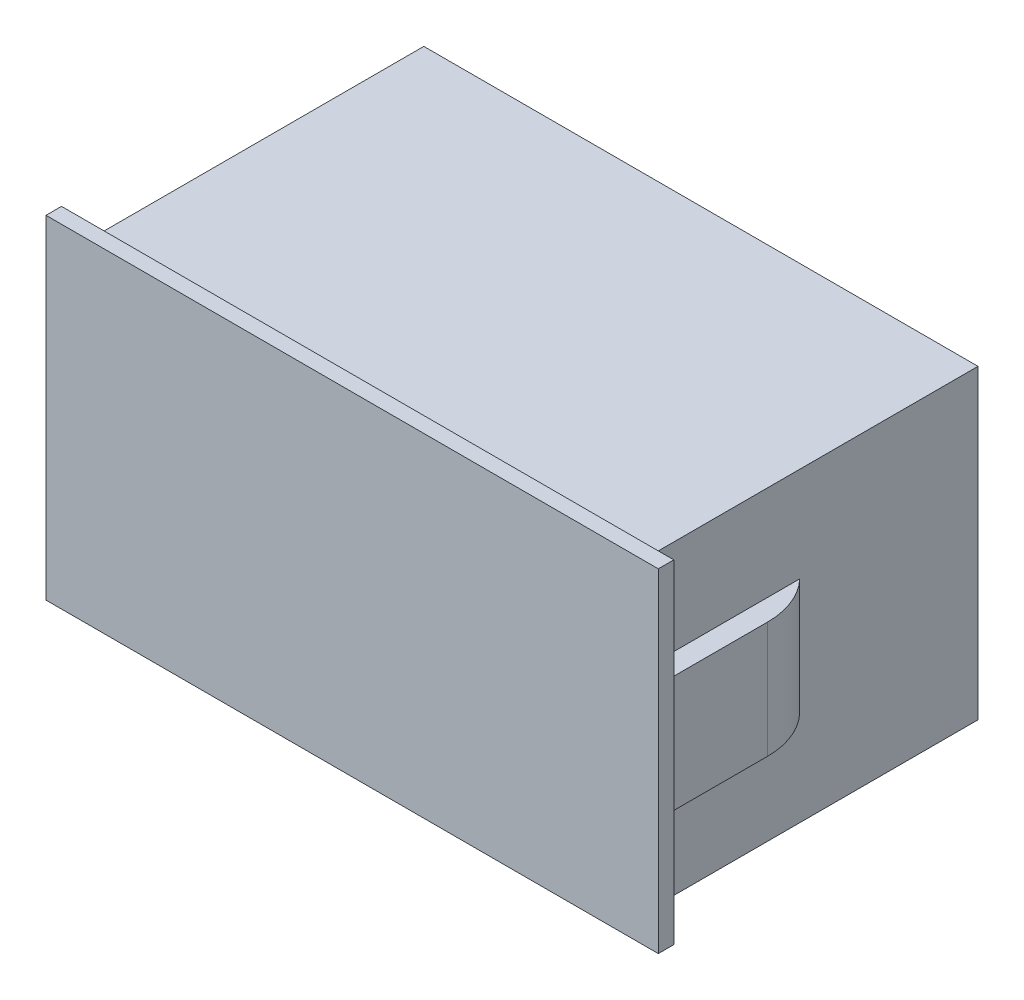
ISO-10303-21;
HEADER;
FILE_DESCRIPTION(('STEP AP214'),'2;1');
FILE_NAME('part.step','',(''),(''),'','','');
FILE_SCHEMA(('AUTOMOTIVE_DESIGN { 1 0 10303 214 1 1 1 1 }'));
ENDSEC;
DATA;
#1=APPLICATION_CONTEXT('core data for automotive mechanical design processes');
#2=APPLICATION_PROTOCOL_DEFINITION('international standard','automotive_design',2000,#1);
#3=PRODUCT_CONTEXT('',#1,'mechanical');
#4=PRODUCT('Part','Part','',(#3));
#5=PRODUCT_RELATED_PRODUCT_CATEGORY('part','',(#4));
#6=PRODUCT_DEFINITION_FORMATION('','',#4);
#7=PRODUCT_DEFINITION_CONTEXT('part definition',#1,'design');
#8=PRODUCT_DEFINITION('design','',#6,#7);
#9=PRODUCT_DEFINITION_SHAPE('','',#8);
#10=(LENGTH_UNIT() NAMED_UNIT(*) SI_UNIT(.MILLI.,.METRE.));
#11=(NAMED_UNIT(*) PLANE_ANGLE_UNIT() SI_UNIT($,.RADIAN.));
#12=(NAMED_UNIT(*) SI_UNIT($,.STERADIAN.) SOLID_ANGLE_UNIT());
#13=UNCERTAINTY_MEASURE_WITH_UNIT(LENGTH_MEASURE(1.E-05),#10,'distance_accuracy_value','');
#14=(GEOMETRIC_REPRESENTATION_CONTEXT(3) GLOBAL_UNCERTAINTY_ASSIGNED_CONTEXT((#13)) GLOBAL_UNIT_ASSIGNED_CONTEXT((#10,
#11,#12)) REPRESENTATION_CONTEXT('',''));
#15=CARTESIAN_POINT('',(0.,0.,0.));
#16=DIRECTION('',(0.,0.,1.));
#17=DIRECTION('',(1.,0.,0.));
#18=AXIS2_PLACEMENT_3D('',#15,#16,#17);
#19=CARTESIAN_POINT('',(0.,0.,43.));
#20=DIRECTION('',(0.,0.,1.));
#21=DIRECTION('',(1.,0.,0.));
#22=AXIS2_PLACEMENT_3D('',#19,#20,#21);
#23=PLANE('',#22);
#24=DIRECTION('',(0.,-1.,0.));
#25=VECTOR('',#24,1.);
#26=CARTESIAN_POINT('',(39.5,-21.5,43.));
#27=LINE('',#26,#25);
#28=CARTESIAN_POINT('',(39.5,21.5,43.));
#29=VERTEX_POINT('',#28);
#30=CARTESIAN_POINT('',(39.5,-21.5,43.));
#31=VERTEX_POINT('',#30);
#32=EDGE_CURVE('E207',#29,#31,#27,.T.);
#33=ORIENTED_EDGE('',*,*,#32,.T.);
#34=DIRECTION('',(-1.,0.,0.));
#35=VECTOR('',#34,1.);
#36=CARTESIAN_POINT('',(-39.5,-21.5,43.));
#37=LINE('',#36,#35);
#38=CARTESIAN_POINT('',(-39.5,-21.5,43.));
#39=VERTEX_POINT('',#38);
#40=EDGE_CURVE('E225',#31,#39,#37,.T.);
#41=ORIENTED_EDGE('',*,*,#40,.T.);
#42=DIRECTION('',(0.,1.,0.));
#43=VECTOR('',#42,1.);
#44=CARTESIAN_POINT('',(-39.5,-21.5,43.));
#45=LINE('',#44,#43);
#46=CARTESIAN_POINT('',(-39.5,21.5,43.));
#47=VERTEX_POINT('',#46);
#48=EDGE_CURVE('E227',#39,#47,#45,.T.);
#49=ORIENTED_EDGE('',*,*,#48,.T.);
#50=DIRECTION('',(1.,0.,0.));
#51=VECTOR('',#50,1.);
#52=CARTESIAN_POINT('',(-39.5,21.5,43.));
#53=LINE('',#52,#51);
#54=EDGE_CURVE('E239',#47,#29,#53,.T.);
#55=ORIENTED_EDGE('',*,*,#54,.T.);
#56=EDGE_LOOP('',(#33,#41,#49,#55));
#57=FACE_BOUND('',#56,.T.);
#58=DIRECTION('',(-1.,0.,0.));
#59=VECTOR('',#58,1.);
#60=CARTESIAN_POINT('',(-38.5,-7.49999999999999,43.));
#61=LINE('',#60,#59);
#62=CARTESIAN_POINT('',(-35.75,-7.49999999999999,43.));
#63=VERTEX_POINT('',#62);
#64=CARTESIAN_POINT('',(-38.5,-7.49999999999999,43.));
#65=VERTEX_POINT('',#64);
#66=EDGE_CURVE('E180',#63,#65,#61,.T.);
#67=ORIENTED_EDGE('',*,*,#66,.F.);
#68=DIRECTION('',(0.,1.,0.));
#69=VECTOR('',#68,1.);
#70=CARTESIAN_POINT('',(-35.75,19.75,43.));
#71=LINE('',#70,#69);
#72=CARTESIAN_POINT('',(-35.75,-19.75,43.));
#73=VERTEX_POINT('',#72);
#74=EDGE_CURVE('E166',#73,#63,#71,.T.);
#75=ORIENTED_EDGE('',*,*,#74,.F.);
#76=DIRECTION('',(-1.,0.,0.));
#77=VECTOR('',#76,1.);
#78=CARTESIAN_POINT('',(35.75,-19.75,43.));
#79=LINE('',#78,#77);
#80=CARTESIAN_POINT('',(35.75,-19.75,43.));
#81=VERTEX_POINT('',#80);
#82=EDGE_CURVE('E220',#81,#73,#79,.T.);
#83=ORIENTED_EDGE('',*,*,#82,.F.);
#84=DIRECTION('',(0.,-1.,0.));
#85=VECTOR('',#84,1.);
#86=CARTESIAN_POINT('',(35.75,19.75,43.));
#87=LINE('',#86,#85);
#88=CARTESIAN_POINT('',(35.75,-7.5,43.));
#89=VERTEX_POINT('',#88);
#90=EDGE_CURVE('E237',#89,#81,#87,.T.);
#91=ORIENTED_EDGE('',*,*,#90,.F.);
#92=DIRECTION('',(-1.,0.,0.));
#93=VECTOR('',#92,1.);
#94=CARTESIAN_POINT('',(38.5,-7.5,43.));
#95=LINE('',#94,#93);
#96=CARTESIAN_POINT('',(38.5,-7.5,43.));
#97=VERTEX_POINT('',#96);
#98=EDGE_CURVE('E190',#97,#89,#95,.T.);
#99=ORIENTED_EDGE('',*,*,#98,.F.);
#100=DIRECTION('',(0.,-1.,0.));
#101=VECTOR('',#100,1.);
#102=CARTESIAN_POINT('',(38.5,7.5,43.));
#103=LINE('',#102,#101);
#104=CARTESIAN_POINT('',(38.5,7.5,43.));
#105=VERTEX_POINT('',#104);
#106=EDGE_CURVE('E193',#105,#97,#103,.T.);
#107=ORIENTED_EDGE('',*,*,#106,.F.);
#108=DIRECTION('',(1.,0.,0.));
#109=VECTOR('',#108,1.);
#110=CARTESIAN_POINT('',(38.5,7.5,43.));
#111=LINE('',#110,#109);
#112=CARTESIAN_POINT('',(35.75,7.5,43.));
#113=VERTEX_POINT('',#112);
#114=EDGE_CURVE('E167',#113,#105,#111,.T.);
#115=ORIENTED_EDGE('',*,*,#114,.F.);
#116=CARTESIAN_POINT('',(35.75,19.75,43.));
#117=VERTEX_POINT('',#116);
#118=EDGE_CURVE('E233',#117,#113,#87,.T.);
#119=ORIENTED_EDGE('',*,*,#118,.F.);
#120=DIRECTION('',(1.,0.,0.));
#121=VECTOR('',#120,1.);
#122=CARTESIAN_POINT('',(35.75,19.75,43.));
#123=LINE('',#122,#121);
#124=CARTESIAN_POINT('',(-35.75,19.75,43.));
#125=VERTEX_POINT('',#124);
#126=EDGE_CURVE('E229',#125,#117,#123,.T.);
#127=ORIENTED_EDGE('',*,*,#126,.F.);
#128=CARTESIAN_POINT('',(-35.75,7.5,43.));
#129=VERTEX_POINT('',#128);
#130=EDGE_CURVE('E230',#129,#125,#71,.T.);
#131=ORIENTED_EDGE('',*,*,#130,.F.);
#132=DIRECTION('',(1.,0.,0.));
#133=VECTOR('',#132,1.);
#134=CARTESIAN_POINT('',(-38.5,7.5,43.));
#135=LINE('',#134,#133);
#136=CARTESIAN_POINT('',(-38.5,7.5,43.));
#137=VERTEX_POINT('',#136);
#138=EDGE_CURVE('E172',#137,#129,#135,.T.);
#139=ORIENTED_EDGE('',*,*,#138,.F.);
#140=DIRECTION('',(0.,1.,0.));
#141=VECTOR('',#140,1.);
#142=CARTESIAN_POINT('',(-38.5,-7.49999999999999,43.));
#143=LINE('',#142,#141);
#144=EDGE_CURVE('E177',#65,#137,#143,.T.);
#145=ORIENTED_EDGE('',*,*,#144,.F.);
#146=EDGE_LOOP('',(#67,#75,#83,#91,#99,#107,#115,#119,#127,#131,#139,#145));
#147=FACE_BOUND('',#146,.T.);
#148=ADVANCED_FACE('F36',(#57,#147),#23,.F.);
#149=CARTESIAN_POINT('',(-35.75,19.75,134.944427287075));
#150=DIRECTION('',(-1.,0.,0.));
#151=DIRECTION('',(0.,0.,1.));
#152=AXIS2_PLACEMENT_3D('',#149,#150,#151);
#153=PLANE('',#152);
#154=ORIENTED_EDGE('',*,*,#74,.T.);
#155=DIRECTION('',(0.,0.,1.));
#156=VECTOR('',#155,1.);
#157=CARTESIAN_POINT('',(-35.75,-7.49999999999999,23.));
#158=LINE('',#157,#156);
#159=CARTESIAN_POINT('',(-35.75,-7.49999999999999,23.));
#160=VERTEX_POINT('',#159);
#161=EDGE_CURVE('E152',#160,#63,#158,.T.);
#162=ORIENTED_EDGE('',*,*,#161,.F.);
#163=DIRECTION('',(0.,-1.,0.));
#164=VECTOR('',#163,1.);
#165=CARTESIAN_POINT('',(-35.75,-7.49999999999999,23.));
#166=LINE('',#165,#164);
#167=CARTESIAN_POINT('',(-35.75,7.5,23.));
#168=VERTEX_POINT('',#167);
#169=EDGE_CURVE('E163',#168,#160,#166,.T.);
#170=ORIENTED_EDGE('',*,*,#169,.F.);
#171=DIRECTION('',(0.,0.,1.));
#172=VECTOR('',#171,1.);
#173=CARTESIAN_POINT('',(-35.75,7.5,23.));
#174=LINE('',#173,#172);
#175=EDGE_CURVE('E171',#168,#129,#174,.T.);
#176=ORIENTED_EDGE('',*,*,#175,.T.);
#177=ORIENTED_EDGE('',*,*,#130,.T.);
#178=DIRECTION('',(0.,0.,-1.));
#179=VECTOR('',#178,1.);
#180=CARTESIAN_POINT('',(-35.75,19.75,134.944427287075));
#181=LINE('',#180,#179);
#182=CARTESIAN_POINT('',(-35.75,19.75,0.));
#183=VERTEX_POINT('',#182);
#184=EDGE_CURVE('E216',#125,#183,#181,.T.);
#185=ORIENTED_EDGE('',*,*,#184,.T.);
#186=DIRECTION('',(0.,1.,0.));
#187=VECTOR('',#186,1.);
#188=CARTESIAN_POINT('',(-35.75,19.75,0.));
#189=LINE('',#188,#187);
#190=CARTESIAN_POINT('',(-35.75,-19.75,0.));
#191=VERTEX_POINT('',#190);
#192=EDGE_CURVE('E221',#191,#183,#189,.T.);
#193=ORIENTED_EDGE('',*,*,#192,.F.);
#194=DIRECTION('',(0.,0.,-1.));
#195=VECTOR('',#194,1.);
#196=CARTESIAN_POINT('',(-35.75,-19.75,134.944427287075));
#197=LINE('',#196,#195);
#198=EDGE_CURVE('E224',#73,#191,#197,.T.);
#199=ORIENTED_EDGE('',*,*,#198,.F.);
#200=EDGE_LOOP('',(#154,#162,#170,#176,#177,#185,#193,#199));
#201=FACE_BOUND('',#200,.T.);
#202=ADVANCED_FACE('F162',(#201),#153,.T.);
#203=CARTESIAN_POINT('',(35.75,19.75,134.944427287075));
#204=DIRECTION('',(1.,0.,0.));
#205=DIRECTION('',(0.,0.,-1.));
#206=AXIS2_PLACEMENT_3D('',#203,#204,#205);
#207=PLANE('',#206);
#208=ORIENTED_EDGE('',*,*,#118,.T.);
#209=DIRECTION('',(0.,0.,1.));
#210=VECTOR('',#209,1.);
#211=CARTESIAN_POINT('',(35.75,7.5,23.));
#212=LINE('',#211,#210);
#213=CARTESIAN_POINT('',(35.75,7.5,23.));
#214=VERTEX_POINT('',#213);
#215=EDGE_CURVE('E204',#214,#113,#212,.T.);
#216=ORIENTED_EDGE('',*,*,#215,.F.);
#217=DIRECTION('',(0.,1.,0.));
#218=VECTOR('',#217,1.);
#219=CARTESIAN_POINT('',(35.75,7.5,23.));
#220=LINE('',#219,#218);
#221=CARTESIAN_POINT('',(35.75,-7.5,23.));
#222=VERTEX_POINT('',#221);
#223=EDGE_CURVE('E186',#222,#214,#220,.T.);
#224=ORIENTED_EDGE('',*,*,#223,.F.);
#225=DIRECTION('',(0.,0.,1.));
#226=VECTOR('',#225,1.);
#227=CARTESIAN_POINT('',(35.75,-7.5,23.));
#228=LINE('',#227,#226);
#229=EDGE_CURVE('E189',#222,#89,#228,.T.);
#230=ORIENTED_EDGE('',*,*,#229,.T.);
#231=ORIENTED_EDGE('',*,*,#90,.T.);
#232=DIRECTION('',(0.,0.,-1.));
#233=VECTOR('',#232,1.);
#234=CARTESIAN_POINT('',(35.75,-19.75,134.944427287075));
#235=LINE('',#234,#233);
#236=CARTESIAN_POINT('',(35.75,-19.75,0.));
#237=VERTEX_POINT('',#236);
#238=EDGE_CURVE('E212',#81,#237,#235,.T.);
#239=ORIENTED_EDGE('',*,*,#238,.T.);
#240=DIRECTION('',(0.,-1.,0.));
#241=VECTOR('',#240,1.);
#242=CARTESIAN_POINT('',(35.75,19.75,0.));
#243=LINE('',#242,#241);
#244=CARTESIAN_POINT('',(35.75,19.75,0.));
#245=VERTEX_POINT('',#244);
#246=EDGE_CURVE('E213',#245,#237,#243,.T.);
#247=ORIENTED_EDGE('',*,*,#246,.F.);
#248=DIRECTION('',(0.,0.,-1.));
#249=VECTOR('',#248,1.);
#250=CARTESIAN_POINT('',(35.75,19.75,134.944427287075));
#251=LINE('',#250,#249);
#252=EDGE_CURVE('E211',#117,#245,#251,.T.);
#253=ORIENTED_EDGE('',*,*,#252,.F.);
#254=EDGE_LOOP('',(#208,#216,#224,#230,#231,#239,#247,#253));
#255=FACE_BOUND('',#254,.T.);
#256=ADVANCED_FACE('F298',(#255),#207,.T.);
#257=CARTESIAN_POINT('',(39.5,21.5,45.));
#258=DIRECTION('',(-1.,0.,0.));
#259=DIRECTION('',(0.,-1.,0.));
#260=AXIS2_PLACEMENT_3D('',#257,#258,#259);
#261=PLANE('',#260);
#262=DIRECTION('',(0.,0.,-1.));
#263=VECTOR('',#262,1.);
#264=CARTESIAN_POINT('',(39.5,-21.5,45.));
#265=LINE('',#264,#263);
#266=CARTESIAN_POINT('',(39.5,-21.5,45.));
#267=VERTEX_POINT('',#266);
#268=EDGE_CURVE('E257',#267,#31,#265,.T.);
#269=ORIENTED_EDGE('',*,*,#268,.T.);
#270=ORIENTED_EDGE('',*,*,#32,.F.);
#271=DIRECTION('',(0.,0.,-1.));
#272=VECTOR('',#271,1.);
#273=CARTESIAN_POINT('',(39.5,21.5,45.));
#274=LINE('',#273,#272);
#275=CARTESIAN_POINT('',(39.5,21.5,45.));
#276=VERTEX_POINT('',#275);
#277=EDGE_CURVE('E266',#276,#29,#274,.T.);
#278=ORIENTED_EDGE('',*,*,#277,.F.);
#279=DIRECTION('',(0.,1.,0.));
#280=VECTOR('',#279,1.);
#281=CARTESIAN_POINT('',(39.5,21.5,45.));
#282=LINE('',#281,#280);
#283=EDGE_CURVE('E236',#267,#276,#282,.T.);
#284=ORIENTED_EDGE('',*,*,#283,.F.);
#285=EDGE_LOOP('',(#269,#270,#278,#284));
#286=FACE_BOUND('',#285,.T.);
#287=ADVANCED_FACE('F339',(#286),#261,.F.);
#288=CARTESIAN_POINT('',(-39.5,21.5,45.));
#289=DIRECTION('',(0.,-1.,0.));
#290=DIRECTION('',(0.,0.,-1.));
#291=AXIS2_PLACEMENT_3D('',#288,#289,#290);
#292=PLANE('',#291);
#293=ORIENTED_EDGE('',*,*,#277,.T.);
#294=ORIENTED_EDGE('',*,*,#54,.F.);
#295=DIRECTION('',(0.,0.,-1.));
#296=VECTOR('',#295,1.);
#297=CARTESIAN_POINT('',(-39.5,21.5,45.));
#298=LINE('',#297,#296);
#299=CARTESIAN_POINT('',(-39.5,21.5,45.));
#300=VERTEX_POINT('',#299);
#301=EDGE_CURVE('E263',#300,#47,#298,.T.);
#302=ORIENTED_EDGE('',*,*,#301,.F.);
#303=DIRECTION('',(-1.,0.,0.));
#304=VECTOR('',#303,1.);
#305=CARTESIAN_POINT('',(-39.5,21.5,45.));
#306=LINE('',#305,#304);
#307=EDGE_CURVE('E251',#276,#300,#306,.T.);
#308=ORIENTED_EDGE('',*,*,#307,.F.);
#309=EDGE_LOOP('',(#293,#294,#302,#308));
#310=FACE_BOUND('',#309,.T.);
#311=ADVANCED_FACE('F335',(#310),#292,.F.);
#312=CARTESIAN_POINT('',(-39.5,21.5,45.));
#313=DIRECTION('',(1.,0.,0.));
#314=DIRECTION('',(0.,1.,0.));
#315=AXIS2_PLACEMENT_3D('',#312,#313,#314);
#316=PLANE('',#315);
#317=ORIENTED_EDGE('',*,*,#301,.T.);
#318=ORIENTED_EDGE('',*,*,#48,.F.);
#319=DIRECTION('',(0.,0.,-1.));
#320=VECTOR('',#319,1.);
#321=CARTESIAN_POINT('',(-39.5,-21.5,45.));
#322=LINE('',#321,#320);
#323=CARTESIAN_POINT('',(-39.5,-21.5,45.));
#324=VERTEX_POINT('',#323);
#325=EDGE_CURVE('E260',#324,#39,#322,.T.);
#326=ORIENTED_EDGE('',*,*,#325,.F.);
#327=DIRECTION('',(0.,-1.,0.));
#328=VECTOR('',#327,1.);
#329=CARTESIAN_POINT('',(-39.5,21.5,45.));
#330=LINE('',#329,#328);
#331=EDGE_CURVE('E253',#300,#324,#330,.T.);
#332=ORIENTED_EDGE('',*,*,#331,.F.);
#333=EDGE_LOOP('',(#317,#318,#326,#332));
#334=FACE_BOUND('',#333,.T.);
#335=ADVANCED_FACE('F331',(#334),#316,.F.);
#336=CARTESIAN_POINT('',(-39.5,-21.5,45.));
#337=DIRECTION('',(0.,1.,0.));
#338=DIRECTION('',(0.,0.,1.));
#339=AXIS2_PLACEMENT_3D('',#336,#337,#338);
#340=PLANE('',#339);
#341=ORIENTED_EDGE('',*,*,#325,.T.);
#342=ORIENTED_EDGE('',*,*,#40,.F.);
#343=ORIENTED_EDGE('',*,*,#268,.F.);
#344=DIRECTION('',(1.,0.,0.));
#345=VECTOR('',#344,1.);
#346=CARTESIAN_POINT('',(-39.5,-21.5,45.));
#347=LINE('',#346,#345);
#348=EDGE_CURVE('E255',#324,#267,#347,.T.);
#349=ORIENTED_EDGE('',*,*,#348,.F.);
#350=EDGE_LOOP('',(#341,#342,#343,#349));
#351=FACE_BOUND('',#350,.T.);
#352=ADVANCED_FACE('F326',(#351),#340,.F.);
#353=CARTESIAN_POINT('',(0.,0.,45.));
#354=DIRECTION('',(0.,0.,1.));
#355=DIRECTION('',(1.,0.,0.));
#356=AXIS2_PLACEMENT_3D('',#353,#354,#355);
#357=PLANE('',#356);
#358=ORIENTED_EDGE('',*,*,#283,.T.);
#359=ORIENTED_EDGE('',*,*,#307,.T.);
#360=ORIENTED_EDGE('',*,*,#331,.T.);
#361=ORIENTED_EDGE('',*,*,#348,.T.);
#362=EDGE_LOOP('',(#358,#359,#360,#361));
#363=FACE_BOUND('',#362,.T.);
#364=ADVANCED_FACE('F324',(#363),#357,.T.);
#365=CARTESIAN_POINT('',(35.75,-19.75,134.944427287075));
#366=DIRECTION('',(0.,-1.,0.));
#367=DIRECTION('',(0.,0.,-1.));
#368=AXIS2_PLACEMENT_3D('',#365,#366,#367);
#369=PLANE('',#368);
#370=ORIENTED_EDGE('',*,*,#82,.T.);
#371=ORIENTED_EDGE('',*,*,#198,.T.);
#372=DIRECTION('',(-1.,0.,0.));
#373=VECTOR('',#372,1.);
#374=CARTESIAN_POINT('',(35.75,-19.75,0.));
#375=LINE('',#374,#373);
#376=EDGE_CURVE('E208',#237,#191,#375,.T.);
#377=ORIENTED_EDGE('',*,*,#376,.F.);
#378=ORIENTED_EDGE('',*,*,#238,.F.);
#379=EDGE_LOOP('',(#370,#371,#377,#378));
#380=FACE_BOUND('',#379,.T.);
#381=ADVANCED_FACE('F293',(#380),#369,.T.);
#382=CARTESIAN_POINT('',(35.75,19.75,134.944427287075));
#383=DIRECTION('',(0.,1.,0.));
#384=DIRECTION('',(0.,0.,1.));
#385=AXIS2_PLACEMENT_3D('',#382,#383,#384);
#386=PLANE('',#385);
#387=ORIENTED_EDGE('',*,*,#126,.T.);
#388=ORIENTED_EDGE('',*,*,#252,.T.);
#389=DIRECTION('',(1.,0.,0.));
#390=VECTOR('',#389,1.);
#391=CARTESIAN_POINT('',(35.75,19.75,0.));
#392=LINE('',#391,#390);
#393=EDGE_CURVE('E217',#183,#245,#392,.T.);
#394=ORIENTED_EDGE('',*,*,#393,.F.);
#395=ORIENTED_EDGE('',*,*,#184,.F.);
#396=EDGE_LOOP('',(#387,#388,#394,#395));
#397=FACE_BOUND('',#396,.T.);
#398=ADVANCED_FACE('F286',(#397),#386,.T.);
#399=CARTESIAN_POINT('',(0.,0.,0.));
#400=DIRECTION('',(0.,0.,1.));
#401=DIRECTION('',(1.,0.,0.));
#402=AXIS2_PLACEMENT_3D('',#399,#400,#401);
#403=PLANE('',#402);
#404=ORIENTED_EDGE('',*,*,#192,.T.);
#405=ORIENTED_EDGE('',*,*,#393,.T.);
#406=ORIENTED_EDGE('',*,*,#246,.T.);
#407=ORIENTED_EDGE('',*,*,#376,.T.);
#408=EDGE_LOOP('',(#404,#405,#406,#407));
#409=FACE_BOUND('',#408,.T.);
#410=ADVANCED_FACE('F288',(#409),#403,.F.);
#411=CARTESIAN_POINT('',(38.5,7.5,23.));
#412=DIRECTION('',(0.,-1.,0.));
#413=DIRECTION('',(0.,0.,-1.));
#414=AXIS2_PLACEMENT_3D('',#411,#412,#413);
#415=PLANE('',#414);
#416=DIRECTION('',(0.,0.,1.));
#417=VECTOR('',#416,1.);
#418=CARTESIAN_POINT('',(38.5,7.5,23.));
#419=LINE('',#418,#417);
#420=CARTESIAN_POINT('',(38.5,7.5,29.887488656978));
#421=VERTEX_POINT('',#420);
#422=EDGE_CURVE('E202',#421,#105,#419,.T.);
#423=ORIENTED_EDGE('',*,*,#422,.F.);
#424=CARTESIAN_POINT('',(28.5,7.5,29.887488656978));
#425=DIRECTION('',(0.,-1.,0.));
#426=DIRECTION('',(0.,0.,-1.));
#427=AXIS2_PLACEMENT_3D('',#424,#425,#426);
#428=CIRCLE('',#427,10.);
#429=EDGE_CURVE('E12',#421,#214,#428,.F.);
#430=ORIENTED_EDGE('',*,*,#429,.T.);
#431=ORIENTED_EDGE('',*,*,#215,.T.);
#432=ORIENTED_EDGE('',*,*,#114,.T.);
#433=EDGE_LOOP('',(#423,#430,#431,#432));
#434=FACE_BOUND('',#433,.T.);
#435=ADVANCED_FACE('F305',(#434),#415,.F.);
#436=CARTESIAN_POINT('',(38.5,7.5,23.));
#437=DIRECTION('',(-1.,0.,0.));
#438=DIRECTION('',(0.,0.,1.));
#439=AXIS2_PLACEMENT_3D('',#436,#437,#438);
#440=PLANE('',#439);
#441=DIRECTION('',(0.,0.,1.));
#442=VECTOR('',#441,1.);
#443=CARTESIAN_POINT('',(38.5,-7.5,23.));
#444=LINE('',#443,#442);
#445=CARTESIAN_POINT('',(38.5,-7.5,29.887488656978));
#446=VERTEX_POINT('',#445);
#447=EDGE_CURVE('E200',#446,#97,#444,.T.);
#448=ORIENTED_EDGE('',*,*,#447,.F.);
#449=DIRECTION('',(0.,-1.,0.));
#450=VECTOR('',#449,1.);
#451=CARTESIAN_POINT('',(38.5,7.5,29.887488656978));
#452=LINE('',#451,#450);
#453=EDGE_CURVE('E44',#446,#421,#452,.F.);
#454=ORIENTED_EDGE('',*,*,#453,.T.);
#455=ORIENTED_EDGE('',*,*,#422,.T.);
#456=ORIENTED_EDGE('',*,*,#106,.T.);
#457=EDGE_LOOP('',(#448,#454,#455,#456));
#458=FACE_BOUND('',#457,.T.);
#459=ADVANCED_FACE('F301',(#458),#440,.F.);
#460=CARTESIAN_POINT('',(38.5,-7.5,23.));
#461=DIRECTION('',(0.,1.,0.));
#462=DIRECTION('',(0.,0.,1.));
#463=AXIS2_PLACEMENT_3D('',#460,#461,#462);
#464=PLANE('',#463);
#465=ORIENTED_EDGE('',*,*,#229,.F.);
#466=CARTESIAN_POINT('',(28.5,-7.5,29.887488656978));
#467=DIRECTION('',(0.,1.,0.));
#468=DIRECTION('',(0.,0.,1.));
#469=AXIS2_PLACEMENT_3D('',#466,#467,#468);
#470=CIRCLE('',#469,10.);
#471=EDGE_CURVE('E58',#222,#446,#470,.F.);
#472=ORIENTED_EDGE('',*,*,#471,.T.);
#473=ORIENTED_EDGE('',*,*,#447,.T.);
#474=ORIENTED_EDGE('',*,*,#98,.T.);
#475=EDGE_LOOP('',(#465,#472,#473,#474));
#476=FACE_BOUND('',#475,.T.);
#477=ADVANCED_FACE('F300',(#476),#464,.F.);
#478=CARTESIAN_POINT('',(-38.5,-7.49999999999999,23.));
#479=DIRECTION('',(0.,1.,0.));
#480=DIRECTION('',(0.,0.,1.));
#481=AXIS2_PLACEMENT_3D('',#478,#479,#480);
#482=PLANE('',#481);
#483=DIRECTION('',(0.,0.,1.));
#484=VECTOR('',#483,1.);
#485=CARTESIAN_POINT('',(-38.5,-7.49999999999999,23.));
#486=LINE('',#485,#484);
#487=CARTESIAN_POINT('',(-38.5,-7.49999999999999,29.8874886569779));
#488=VERTEX_POINT('',#487);
#489=EDGE_CURVE('E153',#488,#65,#486,.T.);
#490=ORIENTED_EDGE('',*,*,#489,.F.);
#491=CARTESIAN_POINT('',(-28.5,-7.49999999999999,29.8874886569779));
#492=DIRECTION('',(0.,1.,0.));
#493=DIRECTION('',(0.,0.,1.));
#494=AXIS2_PLACEMENT_3D('',#491,#492,#493);
#495=CIRCLE('',#494,10.);
#496=EDGE_CURVE('E148',#488,#160,#495,.F.);
#497=ORIENTED_EDGE('',*,*,#496,.T.);
#498=ORIENTED_EDGE('',*,*,#161,.T.);
#499=ORIENTED_EDGE('',*,*,#66,.T.);
#500=EDGE_LOOP('',(#490,#497,#498,#499));
#501=FACE_BOUND('',#500,.T.);
#502=ADVANCED_FACE('F150',(#501),#482,.F.);
#503=CARTESIAN_POINT('',(-38.5,-7.49999999999999,23.));
#504=DIRECTION('',(1.,0.,0.));
#505=DIRECTION('',(0.,1.,0.));
#506=AXIS2_PLACEMENT_3D('',#503,#504,#505);
#507=PLANE('',#506);
#508=DIRECTION('',(0.,0.,1.));
#509=VECTOR('',#508,1.);
#510=CARTESIAN_POINT('',(-38.5,7.5,23.));
#511=LINE('',#510,#509);
#512=CARTESIAN_POINT('',(-38.5,7.5,29.8874886569779));
#513=VERTEX_POINT('',#512);
#514=EDGE_CURVE('E174',#513,#137,#511,.T.);
#515=ORIENTED_EDGE('',*,*,#514,.F.);
#516=DIRECTION('',(0.,1.,0.));
#517=VECTOR('',#516,1.);
#518=CARTESIAN_POINT('',(-38.5,-7.49999999999999,29.8874886569779));
#519=LINE('',#518,#517);
#520=EDGE_CURVE('E157',#513,#488,#519,.F.);
#521=ORIENTED_EDGE('',*,*,#520,.T.);
#522=ORIENTED_EDGE('',*,*,#489,.T.);
#523=ORIENTED_EDGE('',*,*,#144,.T.);
#524=EDGE_LOOP('',(#515,#521,#522,#523));
#525=FACE_BOUND('',#524,.T.);
#526=ADVANCED_FACE('F273',(#525),#507,.F.);
#527=CARTESIAN_POINT('',(-38.5,7.5,23.));
#528=DIRECTION('',(0.,-1.,0.));
#529=DIRECTION('',(0.,0.,-1.));
#530=AXIS2_PLACEMENT_3D('',#527,#528,#529);
#531=PLANE('',#530);
#532=ORIENTED_EDGE('',*,*,#175,.F.);
#533=CARTESIAN_POINT('',(-28.5,7.5,29.8874886569779));
#534=DIRECTION('',(0.,-1.,0.));
#535=DIRECTION('',(0.,0.,-1.));
#536=AXIS2_PLACEMENT_3D('',#533,#534,#535);
#537=CIRCLE('',#536,10.);
#538=EDGE_CURVE('E170',#168,#513,#537,.F.);
#539=ORIENTED_EDGE('',*,*,#538,.T.);
#540=ORIENTED_EDGE('',*,*,#514,.T.);
#541=ORIENTED_EDGE('',*,*,#138,.T.);
#542=EDGE_LOOP('',(#532,#539,#540,#541));
#543=FACE_BOUND('',#542,.T.);
#544=ADVANCED_FACE('F277',(#543),#531,.F.);
#545=CARTESIAN_POINT('',(-28.5,0.,29.8874886569779));
#546=DIRECTION('',(0.,1.,0.));
#547=DIRECTION('',(0.,0.,1.));
#548=AXIS2_PLACEMENT_3D('',#545,#546,#547);
#549=CYLINDRICAL_SURFACE('',#548,10.);
#550=ORIENTED_EDGE('',*,*,#496,.F.);
#551=ORIENTED_EDGE('',*,*,#520,.F.);
#552=ORIENTED_EDGE('',*,*,#538,.F.);
#553=ORIENTED_EDGE('',*,*,#169,.T.);
#554=EDGE_LOOP('',(#550,#551,#552,#553));
#555=FACE_BOUND('',#554,.T.);
#556=ADVANCED_FACE('F169',(#555),#549,.T.);
#557=CARTESIAN_POINT('',(28.5,0.,29.887488656978));
#558=DIRECTION('',(0.,-1.,0.));
#559=DIRECTION('',(0.,0.,-1.));
#560=AXIS2_PLACEMENT_3D('',#557,#558,#559);
#561=CYLINDRICAL_SURFACE('',#560,10.);
#562=ORIENTED_EDGE('',*,*,#429,.F.);
#563=ORIENTED_EDGE('',*,*,#453,.F.);
#564=ORIENTED_EDGE('',*,*,#471,.F.);
#565=ORIENTED_EDGE('',*,*,#223,.T.);
#566=EDGE_LOOP('',(#562,#563,#564,#565));
#567=FACE_BOUND('',#566,.T.);
#568=ADVANCED_FACE('F38',(#567),#561,.T.);
#569=CLOSED_SHELL('',(#148,#202,#256,#287,#311,#335,#352,#364,#381,#398,#410,#435,#459,#477,
#502,#526,#544,#556,#568));
#570=MANIFOLD_SOLID_BREP('B2',#569);
#571=ADVANCED_BREP_SHAPE_REPRESENTATION('',(#18,#570),#14);
#572=SHAPE_DEFINITION_REPRESENTATION(#9,#571);
ENDSEC;
END-ISO-10303-21;
